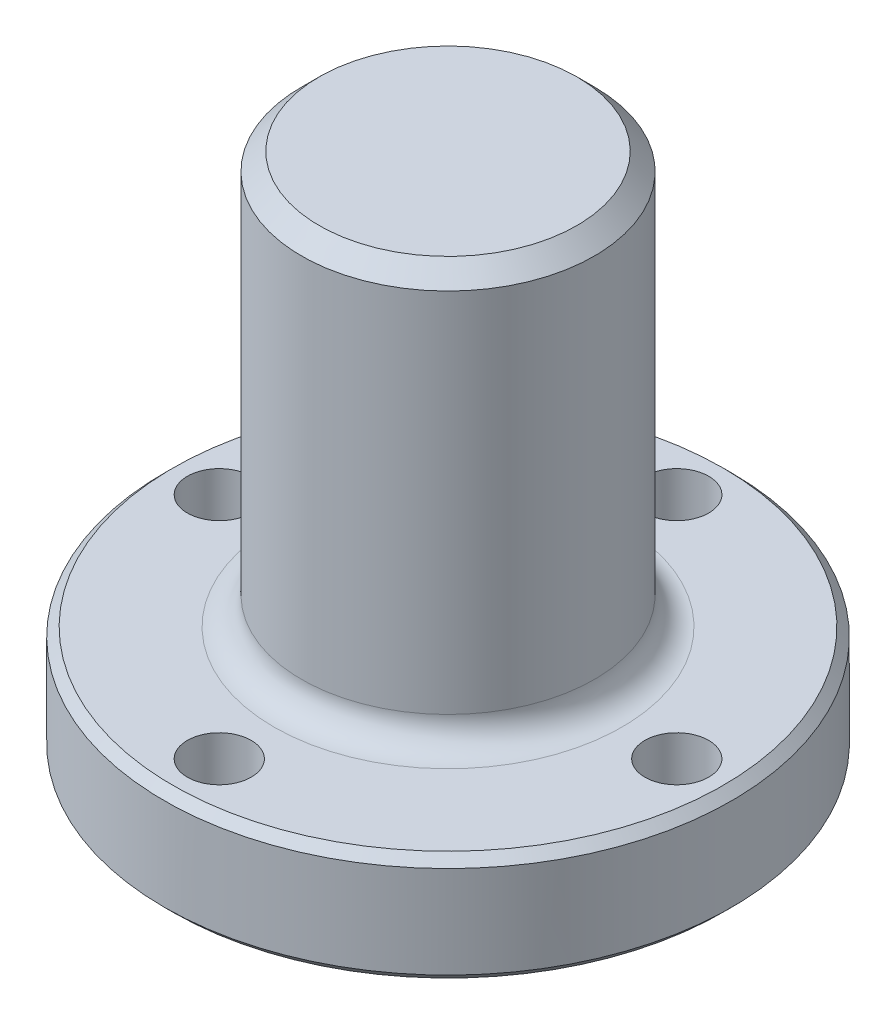
ISO-10303-21;
HEADER;
FILE_DESCRIPTION(('STEP AP214'),'2;1');
FILE_NAME('part.step','',(''),(''),'','','');
FILE_SCHEMA(('AUTOMOTIVE_DESIGN { 1 0 10303 214 1 1 1 1 }'));
ENDSEC;
DATA;
#1=APPLICATION_CONTEXT('core data for automotive mechanical design processes');
#2=APPLICATION_PROTOCOL_DEFINITION('international standard','automotive_design',2000,#1);
#3=PRODUCT_CONTEXT('',#1,'mechanical');
#4=PRODUCT('Part','Part','',(#3));
#5=PRODUCT_RELATED_PRODUCT_CATEGORY('part','',(#4));
#6=PRODUCT_DEFINITION_FORMATION('','',#4);
#7=PRODUCT_DEFINITION_CONTEXT('part definition',#1,'design');
#8=PRODUCT_DEFINITION('design','',#6,#7);
#9=PRODUCT_DEFINITION_SHAPE('','',#8);
#10=(LENGTH_UNIT() NAMED_UNIT(*) SI_UNIT(.MILLI.,.METRE.));
#11=(NAMED_UNIT(*) PLANE_ANGLE_UNIT() SI_UNIT($,.RADIAN.));
#12=(NAMED_UNIT(*) SI_UNIT($,.STERADIAN.) SOLID_ANGLE_UNIT());
#13=UNCERTAINTY_MEASURE_WITH_UNIT(LENGTH_MEASURE(1.E-05),#10,'distance_accuracy_value','');
#14=(GEOMETRIC_REPRESENTATION_CONTEXT(3) GLOBAL_UNCERTAINTY_ASSIGNED_CONTEXT((#13)) GLOBAL_UNIT_ASSIGNED_CONTEXT((#10,
#11,#12)) REPRESENTATION_CONTEXT('',''));
#15=CARTESIAN_POINT('',(0.,0.,0.));
#16=DIRECTION('',(0.,0.,1.));
#17=DIRECTION('',(1.,0.,0.));
#18=AXIS2_PLACEMENT_3D('',#15,#16,#17);
#19=CARTESIAN_POINT('',(0.,-25.0317,0.));
#20=DIRECTION('',(0.,1.,0.));
#21=DIRECTION('',(0.,0.,1.));
#22=AXIS2_PLACEMENT_3D('',#19,#20,#21);
#23=PLANE('',#22);
#24=CARTESIAN_POINT('',(0.,-25.0317,0.));
#25=DIRECTION('',(0.,-1.,0.));
#26=DIRECTION('',(0.,0.,-1.));
#27=AXIS2_PLACEMENT_3D('',#24,#25,#26);
#28=CIRCLE('',#27,8.7122);
#29=CARTESIAN_POINT('',(0.,-25.0317,-8.7122));
#30=VERTEX_POINT('',#29);
#31=EDGE_CURVE('E76',#30,#30,#28,.T.);
#32=ORIENTED_EDGE('',*,*,#31,.T.);
#33=EDGE_LOOP('',(#32));
#34=FACE_BOUND('',#33,.T.);
#35=ADVANCED_FACE('F43',(#34),#23,.F.);
#36=CARTESIAN_POINT('',(0.,-50.4317,0.));
#37=DIRECTION('',(0.,-1.,0.));
#38=DIRECTION('',(0.,0.,-1.));
#39=AXIS2_PLACEMENT_3D('',#36,#37,#38);
#40=CYLINDRICAL_SURFACE('',#39,8.7122);
#41=ORIENTED_EDGE('',*,*,#31,.F.);
#42=EDGE_LOOP('',(#41));
#43=FACE_BOUND('',#42,.T.);
#44=CARTESIAN_POINT('',(0.,-20.2057,0.));
#45=DIRECTION('',(0.,-1.,0.));
#46=DIRECTION('',(0.,0.,-1.));
#47=AXIS2_PLACEMENT_3D('',#44,#45,#46);
#48=CIRCLE('',#47,8.7122);
#49=CARTESIAN_POINT('',(0.,-20.2057,-8.7122));
#50=VERTEX_POINT('',#49);
#51=EDGE_CURVE('E79',#50,#50,#48,.T.);
#52=ORIENTED_EDGE('',*,*,#51,.T.);
#53=EDGE_LOOP('',(#52));
#54=FACE_BOUND('',#53,.T.);
#55=ADVANCED_FACE('F147',(#43,#54),#40,.T.);
#56=CARTESIAN_POINT('',(-8.7122,-20.2057,0.));
#57=DIRECTION('',(0.,1.,0.));
#58=DIRECTION('',(0.,0.,1.));
#59=AXIS2_PLACEMENT_3D('',#56,#57,#58);
#60=PLANE('',#59);
#61=CARTESIAN_POINT('',(0.,-20.2057,0.));
#62=DIRECTION('',(0.,1.,0.));
#63=DIRECTION('',(0.,0.,1.));
#64=AXIS2_PLACEMENT_3D('',#61,#62,#63);
#65=CIRCLE('',#64,23.8506);
#66=CARTESIAN_POINT('',(0.,-20.2057,23.8506));
#67=VERTEX_POINT('',#66);
#68=EDGE_CURVE('E55',#67,#67,#65,.F.);
#69=ORIENTED_EDGE('',*,*,#68,.T.);
#70=EDGE_LOOP('',(#69));
#71=FACE_BOUND('',#70,.T.);
#72=CARTESIAN_POINT('',(0.,-20.2057,19.8374));
#73=DIRECTION('',(0.,1.,0.));
#74=DIRECTION('',(0.,0.,1.));
#75=AXIS2_PLACEMENT_3D('',#72,#73,#74);
#76=CIRCLE('',#75,2.7686);
#77=CARTESIAN_POINT('',(0.,-20.2057,22.606));
#78=VERTEX_POINT('',#77);
#79=EDGE_CURVE('E86',#78,#78,#76,.T.);
#80=ORIENTED_EDGE('',*,*,#79,.T.);
#81=EDGE_LOOP('',(#80));
#82=FACE_BOUND('',#81,.T.);
#83=CARTESIAN_POINT('',(19.8374,-20.2057,0.));
#84=DIRECTION('',(0.,1.,0.));
#85=DIRECTION('',(0.,0.,1.));
#86=AXIS2_PLACEMENT_3D('',#83,#84,#85);
#87=CIRCLE('',#86,2.7686);
#88=CARTESIAN_POINT('',(19.8374,-20.2057,2.7686));
#89=VERTEX_POINT('',#88);
#90=EDGE_CURVE('E95',#89,#89,#87,.T.);
#91=ORIENTED_EDGE('',*,*,#90,.T.);
#92=EDGE_LOOP('',(#91));
#93=FACE_BOUND('',#92,.T.);
#94=CARTESIAN_POINT('',(0.,-20.2057,-19.8374));
#95=DIRECTION('',(0.,1.,0.));
#96=DIRECTION('',(0.,0.,1.));
#97=AXIS2_PLACEMENT_3D('',#94,#95,#96);
#98=CIRCLE('',#97,2.7686);
#99=CARTESIAN_POINT('',(0.,-20.2057,-17.0688));
#100=VERTEX_POINT('',#99);
#101=EDGE_CURVE('E89',#100,#100,#98,.T.);
#102=ORIENTED_EDGE('',*,*,#101,.T.);
#103=EDGE_LOOP('',(#102));
#104=FACE_BOUND('',#103,.T.);
#105=CARTESIAN_POINT('',(-19.8374,-20.2057,0.));
#106=DIRECTION('',(0.,1.,0.));
#107=DIRECTION('',(0.,0.,1.));
#108=AXIS2_PLACEMENT_3D('',#105,#106,#107);
#109=CIRCLE('',#108,2.7686);
#110=CARTESIAN_POINT('',(-19.8374,-20.2057,2.7686));
#111=VERTEX_POINT('',#110);
#112=EDGE_CURVE('E82',#111,#111,#109,.T.);
#113=ORIENTED_EDGE('',*,*,#112,.T.);
#114=EDGE_LOOP('',(#113));
#115=FACE_BOUND('',#114,.T.);
#116=ORIENTED_EDGE('',*,*,#51,.F.);
#117=EDGE_LOOP('',(#116));
#118=FACE_BOUND('',#117,.T.);
#119=ADVANCED_FACE('F107',(#71,#82,#93,#104,#115,#118),#60,.F.);
#120=CARTESIAN_POINT('',(0.,-50.4317,0.));
#121=DIRECTION('',(0.,-1.,0.));
#122=DIRECTION('',(0.,0.,-1.));
#123=AXIS2_PLACEMENT_3D('',#120,#121,#122);
#124=CYLINDRICAL_SURFACE('',#123,24.6126);
#125=CARTESIAN_POINT('',(0.,-11.4427,0.));
#126=DIRECTION('',(0.,-1.,0.));
#127=DIRECTION('',(0.,0.,-1.));
#128=AXIS2_PLACEMENT_3D('',#125,#126,#127);
#129=CIRCLE('',#128,24.6126);
#130=CARTESIAN_POINT('',(0.,-11.4427,-24.6126));
#131=VERTEX_POINT('',#130);
#132=EDGE_CURVE('E64',#131,#131,#129,.T.);
#133=ORIENTED_EDGE('',*,*,#132,.T.);
#134=EDGE_LOOP('',(#133));
#135=FACE_BOUND('',#134,.T.);
#136=CARTESIAN_POINT('',(0.,-19.4437,0.));
#137=DIRECTION('',(0.,1.,0.));
#138=DIRECTION('',(0.,0.,1.));
#139=AXIS2_PLACEMENT_3D('',#136,#137,#138);
#140=CIRCLE('',#139,24.6126);
#141=CARTESIAN_POINT('',(0.,-19.4437,24.6126));
#142=VERTEX_POINT('',#141);
#143=EDGE_CURVE('E67',#142,#142,#140,.T.);
#144=ORIENTED_EDGE('',*,*,#143,.T.);
#145=EDGE_LOOP('',(#144));
#146=FACE_BOUND('',#145,.T.);
#147=ADVANCED_FACE('F122',(#135,#146),#124,.T.);
#148=CARTESIAN_POINT('',(-24.6126,-10.6807,0.));
#149=DIRECTION('',(0.,-1.,0.));
#150=DIRECTION('',(0.,0.,-1.));
#151=AXIS2_PLACEMENT_3D('',#148,#149,#150);
#152=PLANE('',#151);
#153=CARTESIAN_POINT('',(0.,-10.6807,0.));
#154=DIRECTION('',(0.,-1.,0.));
#155=DIRECTION('',(0.,0.,-1.));
#156=AXIS2_PLACEMENT_3D('',#153,#154,#155);
#157=CIRCLE('',#156,23.8506);
#158=CARTESIAN_POINT('',(0.,-10.6807,-23.8506));
#159=VERTEX_POINT('',#158);
#160=EDGE_CURVE('E59',#159,#159,#157,.F.);
#161=ORIENTED_EDGE('',*,*,#160,.T.);
#162=EDGE_LOOP('',(#161));
#163=FACE_BOUND('',#162,.T.);
#164=CARTESIAN_POINT('',(0.,-10.6807,0.));
#165=DIRECTION('',(0.,-1.,0.));
#166=DIRECTION('',(0.,0.,-1.));
#167=AXIS2_PLACEMENT_3D('',#164,#165,#166);
#168=CIRCLE('',#167,15.0876);
#169=CARTESIAN_POINT('',(0.,-10.6807,-15.0876));
#170=VERTEX_POINT('',#169);
#171=EDGE_CURVE('E73',#170,#170,#168,.T.);
#172=ORIENTED_EDGE('',*,*,#171,.T.);
#173=EDGE_LOOP('',(#172));
#174=FACE_BOUND('',#173,.T.);
#175=CARTESIAN_POINT('',(0.,-10.6807,19.8374));
#176=DIRECTION('',(0.,-1.,0.));
#177=DIRECTION('',(0.,0.,-1.));
#178=AXIS2_PLACEMENT_3D('',#175,#176,#177);
#179=CIRCLE('',#178,2.7686);
#180=CARTESIAN_POINT('',(0.,-10.6807,17.0688));
#181=VERTEX_POINT('',#180);
#182=EDGE_CURVE('E101',#181,#181,#179,.T.);
#183=ORIENTED_EDGE('',*,*,#182,.T.);
#184=EDGE_LOOP('',(#183));
#185=FACE_BOUND('',#184,.T.);
#186=CARTESIAN_POINT('',(19.8374,-10.6807,0.));
#187=DIRECTION('',(0.,-1.,0.));
#188=DIRECTION('',(0.,0.,-1.));
#189=AXIS2_PLACEMENT_3D('',#186,#187,#188);
#190=CIRCLE('',#189,2.7686);
#191=CARTESIAN_POINT('',(19.8374,-10.6807,-2.7686));
#192=VERTEX_POINT('',#191);
#193=EDGE_CURVE('E98',#192,#192,#190,.T.);
#194=ORIENTED_EDGE('',*,*,#193,.T.);
#195=EDGE_LOOP('',(#194));
#196=FACE_BOUND('',#195,.T.);
#197=CARTESIAN_POINT('',(0.,-10.6807,-19.8374));
#198=DIRECTION('',(0.,-1.,0.));
#199=DIRECTION('',(0.,0.,-1.));
#200=AXIS2_PLACEMENT_3D('',#197,#198,#199);
#201=CIRCLE('',#200,2.7686);
#202=CARTESIAN_POINT('',(0.,-10.6807,-22.606));
#203=VERTEX_POINT('',#202);
#204=EDGE_CURVE('E92',#203,#203,#201,.T.);
#205=ORIENTED_EDGE('',*,*,#204,.T.);
#206=EDGE_LOOP('',(#205));
#207=FACE_BOUND('',#206,.T.);
#208=CARTESIAN_POINT('',(-19.8374,-10.6807,0.));
#209=DIRECTION('',(0.,-1.,0.));
#210=DIRECTION('',(0.,0.,-1.));
#211=AXIS2_PLACEMENT_3D('',#208,#209,#210);
#212=CIRCLE('',#211,2.7686);
#213=CARTESIAN_POINT('',(-19.8374,-10.6807,-2.7686));
#214=VERTEX_POINT('',#213);
#215=EDGE_CURVE('E83',#214,#214,#212,.T.);
#216=ORIENTED_EDGE('',*,*,#215,.T.);
#217=EDGE_LOOP('',(#216));
#218=FACE_BOUND('',#217,.T.);
#219=ADVANCED_FACE('F118',(#163,#174,#185,#196,#207,#218),#152,.F.);
#220=CARTESIAN_POINT('',(0.,-50.4317,0.));
#221=DIRECTION('',(0.,-1.,0.));
#222=DIRECTION('',(0.,0.,-1.));
#223=AXIS2_PLACEMENT_3D('',#220,#221,#222);
#224=CYLINDRICAL_SURFACE('',#223,12.7);
#225=CARTESIAN_POINT('',(0.,23.5077,0.));
#226=DIRECTION('',(0.,-1.,0.));
#227=DIRECTION('',(0.,0.,-1.));
#228=AXIS2_PLACEMENT_3D('',#225,#226,#227);
#229=CIRCLE('',#228,12.7);
#230=CARTESIAN_POINT('',(0.,23.5077,-12.7));
#231=VERTEX_POINT('',#230);
#232=EDGE_CURVE('E51',#231,#231,#229,.T.);
#233=ORIENTED_EDGE('',*,*,#232,.T.);
#234=EDGE_LOOP('',(#233));
#235=FACE_BOUND('',#234,.T.);
#236=CARTESIAN_POINT('',(0.,-8.2931,0.));
#237=DIRECTION('',(0.,-1.,0.));
#238=DIRECTION('',(0.,0.,-1.));
#239=AXIS2_PLACEMENT_3D('',#236,#237,#238);
#240=CIRCLE('',#239,12.7);
#241=CARTESIAN_POINT('',(0.,-8.2931,-12.7));
#242=VERTEX_POINT('',#241);
#243=EDGE_CURVE('E70',#242,#242,#240,.F.);
#244=ORIENTED_EDGE('',*,*,#243,.T.);
#245=EDGE_LOOP('',(#244));
#246=FACE_BOUND('',#245,.T.);
#247=ADVANCED_FACE('F121',(#235,#246),#224,.T.);
#248=CARTESIAN_POINT('',(-12.7,25.0317,0.));
#249=DIRECTION('',(0.,-1.,0.));
#250=DIRECTION('',(0.,0.,-1.));
#251=AXIS2_PLACEMENT_3D('',#248,#249,#250);
#252=PLANE('',#251);
#253=CARTESIAN_POINT('',(0.,25.0317,0.));
#254=DIRECTION('',(0.,-1.,0.));
#255=DIRECTION('',(0.,0.,-1.));
#256=AXIS2_PLACEMENT_3D('',#253,#254,#255);
#257=CIRCLE('',#256,11.176);
#258=CARTESIAN_POINT('',(0.,25.0317,-11.176));
#259=VERTEX_POINT('',#258);
#260=EDGE_CURVE('E10',#259,#259,#257,.F.);
#261=ORIENTED_EDGE('',*,*,#260,.T.);
#262=EDGE_LOOP('',(#261));
#263=FACE_BOUND('',#262,.T.);
#264=ADVANCED_FACE('F134',(#263),#252,.F.);
#265=CARTESIAN_POINT('',(-19.8374,25.0317,0.));
#266=DIRECTION('',(0.,-1.,0.));
#267=DIRECTION('',(0.,0.,-1.));
#268=AXIS2_PLACEMENT_3D('',#265,#266,#267);
#269=CYLINDRICAL_SURFACE('',#268,2.7686);
#270=ORIENTED_EDGE('',*,*,#112,.F.);
#271=EDGE_LOOP('',(#270));
#272=FACE_BOUND('',#271,.T.);
#273=ORIENTED_EDGE('',*,*,#215,.F.);
#274=EDGE_LOOP('',(#273));
#275=FACE_BOUND('',#274,.T.);
#276=ADVANCED_FACE('F131',(#272,#275),#269,.F.);
#277=CARTESIAN_POINT('',(0.,25.0317,-19.8374));
#278=DIRECTION('',(0.,-1.,0.));
#279=DIRECTION('',(0.,0.,-1.));
#280=AXIS2_PLACEMENT_3D('',#277,#278,#279);
#281=CYLINDRICAL_SURFACE('',#280,2.7686);
#282=ORIENTED_EDGE('',*,*,#101,.F.);
#283=EDGE_LOOP('',(#282));
#284=FACE_BOUND('',#283,.T.);
#285=ORIENTED_EDGE('',*,*,#204,.F.);
#286=EDGE_LOOP('',(#285));
#287=FACE_BOUND('',#286,.T.);
#288=ADVANCED_FACE('F133',(#284,#287),#281,.F.);
#289=CARTESIAN_POINT('',(19.8374,25.0317,0.));
#290=DIRECTION('',(0.,-1.,0.));
#291=DIRECTION('',(0.,0.,-1.));
#292=AXIS2_PLACEMENT_3D('',#289,#290,#291);
#293=CYLINDRICAL_SURFACE('',#292,2.7686);
#294=ORIENTED_EDGE('',*,*,#90,.F.);
#295=EDGE_LOOP('',(#294));
#296=FACE_BOUND('',#295,.T.);
#297=ORIENTED_EDGE('',*,*,#193,.F.);
#298=EDGE_LOOP('',(#297));
#299=FACE_BOUND('',#298,.T.);
#300=ADVANCED_FACE('F114',(#296,#299),#293,.F.);
#301=CARTESIAN_POINT('',(0.,25.0317,19.8374));
#302=DIRECTION('',(0.,-1.,0.));
#303=DIRECTION('',(0.,0.,-1.));
#304=AXIS2_PLACEMENT_3D('',#301,#302,#303);
#305=CYLINDRICAL_SURFACE('',#304,2.7686);
#306=ORIENTED_EDGE('',*,*,#79,.F.);
#307=EDGE_LOOP('',(#306));
#308=FACE_BOUND('',#307,.T.);
#309=ORIENTED_EDGE('',*,*,#182,.F.);
#310=EDGE_LOOP('',(#309));
#311=FACE_BOUND('',#310,.T.);
#312=ADVANCED_FACE('F110',(#308,#311),#305,.F.);
#313=CARTESIAN_POINT('',(0.,-8.2931,0.));
#314=DIRECTION('',(0.,-1.,0.));
#315=DIRECTION('',(0.,0.,-1.));
#316=AXIS2_PLACEMENT_3D('',#313,#314,#315);
#317=TOROIDAL_SURFACE('',#316,15.0876,2.3876);
#318=ORIENTED_EDGE('',*,*,#243,.F.);
#319=EDGE_LOOP('',(#318));
#320=FACE_BOUND('',#319,.T.);
#321=ORIENTED_EDGE('',*,*,#171,.F.);
#322=EDGE_LOOP('',(#321));
#323=FACE_BOUND('',#322,.T.);
#324=ADVANCED_FACE('F113',(#320,#323),#317,.F.);
#325=CARTESIAN_POINT('',(0.,-11.4427,0.));
#326=DIRECTION('',(0.,-1.,0.));
#327=DIRECTION('',(0.,0.,-1.));
#328=AXIS2_PLACEMENT_3D('',#325,#326,#327);
#329=CONICAL_SURFACE('',#328,24.6126,0.785398163397457);
#330=ORIENTED_EDGE('',*,*,#160,.F.);
#331=EDGE_LOOP('',(#330));
#332=FACE_BOUND('',#331,.T.);
#333=ORIENTED_EDGE('',*,*,#132,.F.);
#334=EDGE_LOOP('',(#333));
#335=FACE_BOUND('',#334,.T.);
#336=ADVANCED_FACE('F158',(#332,#335),#329,.T.);
#337=CARTESIAN_POINT('',(0.,-20.2057,0.));
#338=DIRECTION('',(0.,1.,0.));
#339=DIRECTION('',(0.,0.,1.));
#340=AXIS2_PLACEMENT_3D('',#337,#338,#339);
#341=CONICAL_SURFACE('',#340,23.8506,0.785398163397432);
#342=ORIENTED_EDGE('',*,*,#143,.F.);
#343=EDGE_LOOP('',(#342));
#344=FACE_BOUND('',#343,.T.);
#345=ORIENTED_EDGE('',*,*,#68,.F.);
#346=EDGE_LOOP('',(#345));
#347=FACE_BOUND('',#346,.T.);
#348=ADVANCED_FACE('F165',(#344,#347),#341,.T.);
#349=CARTESIAN_POINT('',(0.,23.5077,0.));
#350=DIRECTION('',(0.,-1.,0.));
#351=DIRECTION('',(0.,0.,-1.));
#352=AXIS2_PLACEMENT_3D('',#349,#350,#351);
#353=CONICAL_SURFACE('',#352,12.7,0.785398163397454);
#354=ORIENTED_EDGE('',*,*,#260,.F.);
#355=EDGE_LOOP('',(#354));
#356=FACE_BOUND('',#355,.T.);
#357=ORIENTED_EDGE('',*,*,#232,.F.);
#358=EDGE_LOOP('',(#357));
#359=FACE_BOUND('',#358,.T.);
#360=ADVANCED_FACE('F46',(#356,#359),#353,.T.);
#361=CLOSED_SHELL('',(#35,#55,#119,#147,#219,#247,#264,#276,#288,#300,#312,#324,#336,#348,#360));
#362=MANIFOLD_SOLID_BREP('B2',#361);
#363=ADVANCED_BREP_SHAPE_REPRESENTATION('',(#18,#362),#14);
#364=SHAPE_DEFINITION_REPRESENTATION(#9,#363);
ENDSEC;
END-ISO-10303-21;
